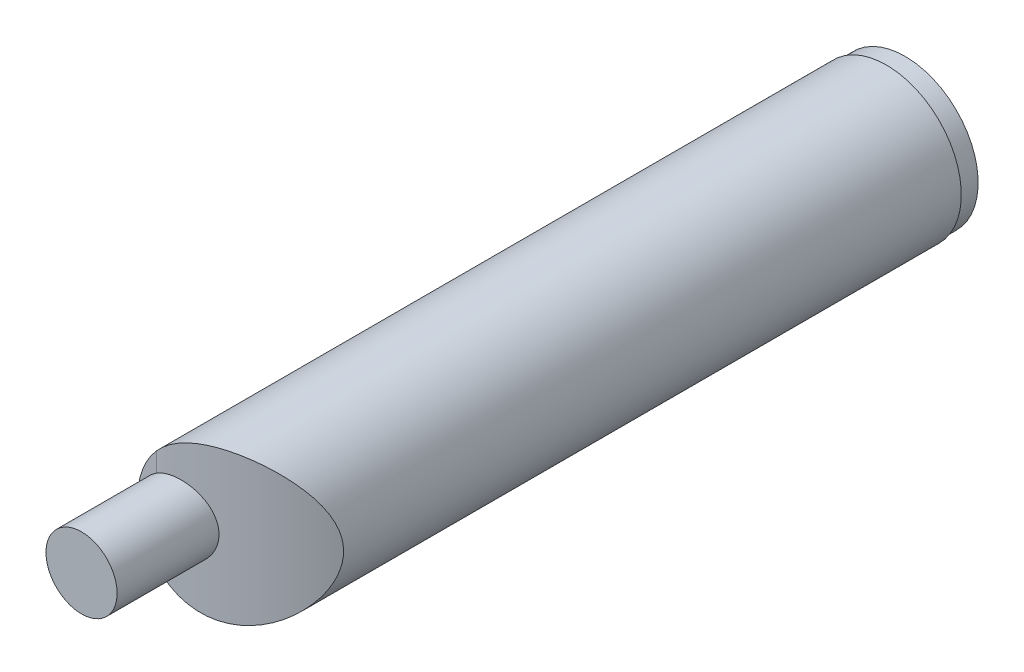
ISO-10303-21;
HEADER;
FILE_DESCRIPTION(('STEP AP214'),'2;1');
FILE_NAME('part.step','',(''),(''),'','','');
FILE_SCHEMA(('AUTOMOTIVE_DESIGN { 1 0 10303 214 1 1 1 1 }'));
ENDSEC;
DATA;
#1=APPLICATION_CONTEXT('core data for automotive mechanical design processes');
#2=APPLICATION_PROTOCOL_DEFINITION('international standard','automotive_design',2000,#1);
#3=PRODUCT_CONTEXT('',#1,'mechanical');
#4=PRODUCT('Part','Part','',(#3));
#5=PRODUCT_RELATED_PRODUCT_CATEGORY('part','',(#4));
#6=PRODUCT_DEFINITION_FORMATION('','',#4);
#7=PRODUCT_DEFINITION_CONTEXT('part definition',#1,'design');
#8=PRODUCT_DEFINITION('design','',#6,#7);
#9=PRODUCT_DEFINITION_SHAPE('','',#8);
#10=(LENGTH_UNIT() NAMED_UNIT(*) SI_UNIT(.MILLI.,.METRE.));
#11=(NAMED_UNIT(*) PLANE_ANGLE_UNIT() SI_UNIT($,.RADIAN.));
#12=(NAMED_UNIT(*) SI_UNIT($,.STERADIAN.) SOLID_ANGLE_UNIT());
#13=UNCERTAINTY_MEASURE_WITH_UNIT(LENGTH_MEASURE(1.E-05),#10,'distance_accuracy_value','');
#14=(GEOMETRIC_REPRESENTATION_CONTEXT(3) GLOBAL_UNCERTAINTY_ASSIGNED_CONTEXT((#13)) GLOBAL_UNIT_ASSIGNED_CONTEXT((#10,
#11,#12)) REPRESENTATION_CONTEXT('',''));
#15=CARTESIAN_POINT('',(0.,0.,0.));
#16=DIRECTION('',(0.,0.,1.));
#17=DIRECTION('',(1.,0.,0.));
#18=AXIS2_PLACEMENT_3D('',#15,#16,#17);
#19=CARTESIAN_POINT('',(0.,0.,37.));
#20=DIRECTION('',(0.,0.,1.));
#21=DIRECTION('',(1.,0.,0.));
#22=AXIS2_PLACEMENT_3D('',#19,#20,#21);
#23=PLANE('',#22);
#24=DIRECTION('',(0.,1.,0.));
#25=VECTOR('',#24,1.);
#26=CARTESIAN_POINT('',(-3.,-4.,37.));
#27=LINE('',#26,#25);
#28=CARTESIAN_POINT('',(-3.,-1.61554944214035,37.));
#29=VERTEX_POINT('',#28);
#30=CARTESIAN_POINT('',(-3.,-2.64575131106459,37.));
#31=VERTEX_POINT('',#30);
#32=EDGE_CURVE('E50',#29,#31,#27,.F.);
#33=ORIENTED_EDGE('',*,*,#32,.F.);
#34=CARTESIAN_POINT('',(-2.,0.,37.));
#35=DIRECTION('',(0.,0.,1.));
#36=DIRECTION('',(1.,0.,0.));
#37=AXIS2_PLACEMENT_3D('',#34,#35,#36);
#38=CIRCLE('',#37,1.9);
#39=CARTESIAN_POINT('',(-3.,1.61554944214035,37.));
#40=VERTEX_POINT('',#39);
#41=EDGE_CURVE('E72',#40,#29,#38,.T.);
#42=ORIENTED_EDGE('',*,*,#41,.F.);
#43=CARTESIAN_POINT('',(-3.,2.64575131106459,37.));
#44=VERTEX_POINT('',#43);
#45=EDGE_CURVE('E12',#44,#40,#27,.F.);
#46=ORIENTED_EDGE('',*,*,#45,.F.);
#47=CARTESIAN_POINT('',(0.,0.,37.));
#48=DIRECTION('',(0.,0.,1.));
#49=DIRECTION('',(1.,0.,0.));
#50=AXIS2_PLACEMENT_3D('',#47,#48,#49);
#51=CIRCLE('',#50,4.);
#52=EDGE_CURVE('E117',#44,#31,#51,.T.);
#53=ORIENTED_EDGE('',*,*,#52,.T.);
#54=EDGE_LOOP('',(#33,#42,#46,#53));
#55=FACE_BOUND('',#54,.T.);
#56=ADVANCED_FACE('F41',(#55),#23,.T.);
#57=CARTESIAN_POINT('',(-3.,-4.,27.3333333333333));
#58=DIRECTION('',(0.,1.,0.));
#59=DIRECTION('',(0.,0.,1.));
#60=AXIS2_PLACEMENT_3D('',#57,#58,#59);
#61=CYLINDRICAL_SURFACE('',#60,9.66666666666666);
#62=CARTESIAN_POINT('',(-3.,-1.61554944214035,37.));
#63=CARTESIAN_POINT('',(-2.95517958061528,-1.64329252204888,37.000001032105));
#64=CARTESIAN_POINT('',(-2.90922461089328,-1.66915645677503,36.99968779637));
#65=CARTESIAN_POINT('',(-2.8153357049746,-1.71697580833333,36.9983500260045));
#66=CARTESIAN_POINT('',(-2.76740181313537,-1.73893131271423,36.9973255073091));
#67=CARTESIAN_POINT('',(-2.6212541707077,-1.79863383992959,36.9930664159992));
#68=CARTESIAN_POINT('',(-2.52051730289532,-1.83032626236258,36.9886469520318));
#69=CARTESIAN_POINT('',(-2.31538706046502,-1.87659482098436,36.9762750540139));
#70=CARTESIAN_POINT('',(-2.21099152213248,-1.89116064651174,36.9683204957099));
#71=CARTESIAN_POINT('',(-2.00156850833603,-1.90288972701268,36.9488743750572));
#72=CARTESIAN_POINT('',(-1.89654115152249,-1.90005615344103,36.9373834576568));
#73=CARTESIAN_POINT('',(-1.68850211351172,-1.87721945316173,36.91119557089));
#74=CARTESIAN_POINT('',(-1.58549661541911,-1.85717015455387,36.8964900592374));
#75=CARTESIAN_POINT('',(-1.38450616355193,-1.80057583544492,36.8645971177407));
#76=CARTESIAN_POINT('',(-1.28652279026819,-1.76402565708877,36.8474089129983));
#77=CARTESIAN_POINT('',(-1.09588130480718,-1.67448991963964,36.8111187186533));
#78=CARTESIAN_POINT('',(-1.0034004134651,-1.62114133626977,36.7919814750124));
#79=CARTESIAN_POINT('',(-0.828686284516865,-1.49978030894426,36.753410691243));
#80=CARTESIAN_POINT('',(-0.746453997099637,-1.43176650691134,36.7339771238283));
#81=CARTESIAN_POINT('',(-0.592888034908227,-1.2813319837602,36.6958462018077));
#82=CARTESIAN_POINT('',(-0.521799029763533,-1.19865545897162,36.6771706859926));
#83=CARTESIAN_POINT('',(-0.39457622075868,-1.02198823257589,36.6424994167669));
#84=CARTESIAN_POINT('',(-0.338441569956993,-0.927998172149993,36.6265035116151));
#85=CARTESIAN_POINT('',(-0.243703350100563,-0.732805740717833,36.5988437200598));
#86=CARTESIAN_POINT('',(-0.204839366821026,-0.631739134851262,36.5871160035496));
#87=CARTESIAN_POINT('',(-0.144776397894455,-0.424052009574895,36.5687619987074));
#88=CARTESIAN_POINT('',(-0.123571639667147,-0.317433317191539,36.5621340433809));
#89=CARTESIAN_POINT('',(-0.100137065887266,-0.106410831973574,36.554796497094));
#90=CARTESIAN_POINT('',(-0.0971586472445877,-0.00209784625910809,36.5538534378124));
#91=CARTESIAN_POINT('',(-0.108289649199356,0.205512126969769,36.5573503167647));
#92=CARTESIAN_POINT('',(-0.122397254689809,0.308809221230669,36.5617896832053));
#93=CARTESIAN_POINT('',(-0.166773455177286,0.509572862967182,36.575507918806));
#94=CARTESIAN_POINT('',(-0.196749392878213,0.607110532850305,36.5846990817445));
#95=CARTESIAN_POINT('',(-0.271682870831143,0.795754152379224,36.6070731491861));
#96=CARTESIAN_POINT('',(-0.31664246828715,0.886859216768184,36.6202566017938));
#97=CARTESIAN_POINT('',(-0.421623582745281,1.06278158376739,36.6499563718835));
#98=CARTESIAN_POINT('',(-0.482022001466008,1.14736002773485,36.6665536892428));
#99=CARTESIAN_POINT('',(-0.615542613626594,1.30536678920883,36.701554233994));
#100=CARTESIAN_POINT('',(-0.688667424953865,1.37879280677008,36.7199578326072));
#101=CARTESIAN_POINT('',(-0.848891226532715,1.51540810472139,36.7579927900611));
#102=CARTESIAN_POINT('',(-0.936427285850951,1.5780800692756,36.7776439535781));
#103=CARTESIAN_POINT('',(-1.12096236909848,1.68784476875298,36.8160827448242));
#104=CARTESIAN_POINT('',(-1.21796247175424,1.73493572503594,36.8348702737549));
#105=CARTESIAN_POINT('',(-1.41981129037897,1.81250569515798,36.8705256886973));
#106=CARTESIAN_POINT('',(-1.52472482666052,1.84282551461708,36.8873740152814));
#107=CARTESIAN_POINT('',(-1.73862747103469,1.88508947435926,36.9179586742784));
#108=CARTESIAN_POINT('',(-1.8476158207198,1.89703701683703,36.9316955824646));
#109=CARTESIAN_POINT('',(-2.06397514459689,1.90193516242466,36.9551774101759));
#110=CARTESIAN_POINT('',(-2.17132786900129,1.89530412930968,36.965004643056));
#111=CARTESIAN_POINT('',(-2.3836381394675,1.86395281080554,36.9809165360836));
#112=CARTESIAN_POINT('',(-2.48859668876145,1.8392402512428,36.9870027926224));
#113=CARTESIAN_POINT('',(-2.66240982445681,1.78238939027777,36.9943707269203));
#114=CARTESIAN_POINT('',(-2.73270356887788,1.75465776673282,36.9965436444483));
#115=CARTESIAN_POINT('',(-2.86944648349164,1.69108093258636,36.9993623525555));
#116=CARTESIAN_POINT('',(-2.93590033823768,1.65524588202983,37.000010043949));
#117=CARTESIAN_POINT('',(-3.,1.61554944214035,37.));
#118=B_SPLINE_CURVE_WITH_KNOTS('',3,(#62,#63,#64,#65,#66,#67,#68,#69,#70,#71,#72,#73,#74,#75,
#76,#77,#78,#79,#80,#81,#82,#83,#84,#85,#86,#87,#88,#89,#90,#91,#92,#93,#94,#95,#96,#97,#98,#99,
#100,#101,#102,#103,#104,#105,#106,#107,#108,#109,#110,#111,#112,#113,#114,#115,#116,#117),
.UNSPECIFIED.,.F.,.F.,(4,2,2,2,2,2,2,2,2,2,2,2,2,2,2,2,2,2,2,2,2,2,2,2,2,2,2,4),(0.,
0.158040314803775,0.316077089062983,0.631533991882929,0.947180710968673,1.26276989763209,
1.57920813522519,1.89574535383446,2.21965622731877,2.54359710956618,2.8738749919205,
3.2041341649715,3.52922893911353,3.85421740207206,4.16576295753149,4.47727541934,
4.7832332041926,5.08923301329486,5.40356767110819,5.71796706584309,6.04475389049804,
6.37157800643768,6.70145336718532,7.03126763395883,7.35371501333552,7.67602469865251,
7.90229726183293,8.12828768306414),.UNSPECIFIED.);
#119=EDGE_CURVE('E56',#29,#40,#118,.T.);
#120=ORIENTED_EDGE('',*,*,#119,.F.);
#121=ORIENTED_EDGE('',*,*,#32,.T.);
#122=CARTESIAN_POINT('',(-3.,2.64575131106459,37.));
#123=CARTESIAN_POINT('',(-2.92874344411386,2.72656833880474,37.0000026929973));
#124=CARTESIAN_POINT('',(-2.85419861601261,2.80449367333995,36.9992124183074));
#125=CARTESIAN_POINT('',(-2.69908461475097,2.95406911188603,36.9956259653642));
#126=CARTESIAN_POINT('',(-2.61851460338466,3.02571833976148,36.9928295075499));
#127=CARTESIAN_POINT('',(-2.45194175088313,3.16221122973203,36.9848114066328));
#128=CARTESIAN_POINT('',(-2.36594016231447,3.22705645177371,36.9795903209178));
#129=CARTESIAN_POINT('',(-2.1891422961328,3.34950981012562,36.966339585779));
#130=CARTESIAN_POINT('',(-2.09834637843114,3.40711848859081,36.9583101469251));
#131=CARTESIAN_POINT('',(-1.91252526820566,3.51479661198446,36.9390909359259));
#132=CARTESIAN_POINT('',(-1.81749402150079,3.56485478485893,36.9278965090374));
#133=CARTESIAN_POINT('',(-1.62406290496324,3.6570345748119,36.9020722430745));
#134=CARTESIAN_POINT('',(-1.52566181382864,3.69915327770852,36.8874411469797));
#135=CARTESIAN_POINT('',(-1.32645424821065,3.77516501795386,36.8545657396904));
#136=CARTESIAN_POINT('',(-1.22565072312854,3.80906762291307,36.8363256765417));
#137=CARTESIAN_POINT('',(-1.02232354130945,3.86860205669459,36.7961017357514));
#138=CARTESIAN_POINT('',(-0.919799266398736,3.89423084324482,36.7741164855384));
#139=CARTESIAN_POINT('',(-0.715658602760959,3.93681512441491,36.7267890383231));
#140=CARTESIAN_POINT('',(-0.614056849194816,3.95391197938267,36.7015109591809));
#141=CARTESIAN_POINT('',(-0.410768834027507,3.98017475638854,36.6473776930199));
#142=CARTESIAN_POINT('',(-0.309082555208066,3.98933784626417,36.6185212328045));
#143=CARTESIAN_POINT('',(-0.0049603327433194,4.00513483658308,36.5267464130026));
#144=CARTESIAN_POINT('',(0.196628289481214,4.00009461277808,36.4586020395277));
#145=CARTESIAN_POINT('',(0.60159714223103,3.95998913295275,36.3067391447954));
#146=CARTESIAN_POINT('',(0.804608512255116,3.92351054570256,36.2224350600644));
#147=CARTESIAN_POINT('',(1.19833185521531,3.82169635277293,36.043399861453));
#148=CARTESIAN_POINT('',(1.38904220917318,3.75635695747048,35.9486673794791));
#149=CARTESIAN_POINT('',(1.77881397658153,3.58975378245759,35.7394239085914));
#150=CARTESIAN_POINT('',(1.97583567187145,3.48496978989151,35.6239316169755));
#151=CARTESIAN_POINT('',(2.34848795692548,3.24557442011722,35.388563858778));
#152=CARTESIAN_POINT('',(2.52408306453907,3.11091458065686,35.2686815378944));
#153=CARTESIAN_POINT('',(2.78045845835395,2.8783237558762,35.0821387269153));
#154=CARTESIAN_POINT('',(2.86940372121545,2.7896912950124,35.0148812345799));
#155=CARTESIAN_POINT('',(3.03920127263234,2.60367379812992,34.8821138878305));
#156=CARTESIAN_POINT('',(3.12005138772456,2.50628642475712,34.8166045062104));
#157=CARTESIAN_POINT('',(3.27293183980788,2.30305505681702,34.6889214332201));
#158=CARTESIAN_POINT('',(3.34497539956034,2.19722414488533,34.6267428216752));
#159=CARTESIAN_POINT('',(3.47959564824296,1.97712970024364,34.5074099851794));
#160=CARTESIAN_POINT('',(3.54217800392595,1.862871276672,34.4502527613502));
#161=CARTESIAN_POINT('',(3.6733067083788,1.59229689241465,34.3277295748455));
#162=CARTESIAN_POINT('',(3.73848625178331,1.43326221995032,34.2646530121973));
#163=CARTESIAN_POINT('',(3.84889048744412,1.10282032668692,34.1555939474905));
#164=CARTESIAN_POINT('',(3.89414575035773,0.931432533371165,34.1095852746483));
#165=CARTESIAN_POINT('',(3.9450656101658,0.666849780157054,34.057252527945));
#166=CARTESIAN_POINT('',(3.95924359622614,0.576861003822951,34.0425525829217));
#167=CARTESIAN_POINT('',(3.98146204643081,0.39534983419803,34.0194305776106));
#168=CARTESIAN_POINT('',(3.98950564335262,0.303828248138117,34.0110053129517));
#169=CARTESIAN_POINT('',(3.9992539324286,0.120106231005828,34.0007871795469));
#170=CARTESIAN_POINT('',(4.00096084884665,0.0279060495187175,33.998991983555));
#171=CARTESIAN_POINT('',(3.99800956039643,-0.156250856689758,34.0020890037284));
#172=CARTESIAN_POINT('',(3.99335190956097,-0.248207601904009,34.006980637808));
#173=CARTESIAN_POINT('',(3.97215891080682,-0.496716627410485,34.0291436665878));
#174=CARTESIAN_POINT('',(3.94949691645758,-0.652247912010089,34.0527815522623));
#175=CARTESIAN_POINT('',(3.88713995385376,-0.956205609506684,34.1166721530481));
#176=CARTESIAN_POINT('',(3.84743163376507,-1.1046263514359,34.1569378912745));
#177=CARTESIAN_POINT('',(3.73434636457543,-1.44883757630186,34.268861751576));
#178=CARTESIAN_POINT('',(3.65386958599505,-1.64029342739702,34.3466379694382));
#179=CARTESIAN_POINT('',(3.46827071755913,-2.00321014569202,34.5181698266454));
#180=CARTESIAN_POINT('',(3.36309068199038,-2.17462255942295,34.6119628928663));
#181=CARTESIAN_POINT('',(3.17302908125662,-2.43886018136553,34.77293631463));
#182=CARTESIAN_POINT('',(3.09438518485591,-2.53783125026085,34.8376052673484));
#183=CARTESIAN_POINT('',(2.92889605003813,-2.72715528020355,34.9690246136126));
#184=CARTESIAN_POINT('',(2.84205181617015,-2.81750929412967,35.035774751542));
#185=CARTESIAN_POINT('',(2.66059908004062,-2.98945489693459,35.170093958532));
#186=CARTESIAN_POINT('',(2.56598755144775,-3.07104304155433,35.2376633379663));
#187=CARTESIAN_POINT('',(2.36941399426397,-3.22513131932479,35.3724901121093));
#188=CARTESIAN_POINT('',(2.26745170472932,-3.29763112959941,35.4397474956521));
#189=CARTESIAN_POINT('',(2.05592940273685,-3.4335185756147,35.5733432708493));
#190=CARTESIAN_POINT('',(1.94632725242728,-3.49684858012791,35.6396736670128));
#191=CARTESIAN_POINT('',(1.72056966757837,-3.61327567922718,35.7700178673663));
#192=CARTESIAN_POINT('',(1.60441706478977,-3.66637715241393,35.8340326532417));
#193=CARTESIAN_POINT('',(1.36609998442459,-3.76167969117209,35.9588595655241));
#194=CARTESIAN_POINT('',(1.2439370362538,-3.80388351287906,36.0196724986111));
#195=CARTESIAN_POINT('',(0.994299413887674,-3.87663063623035,36.1372554002671));
#196=CARTESIAN_POINT('',(0.866825286990128,-3.90717513604572,36.1940257837809));
#197=CARTESIAN_POINT('',(0.615209704788986,-3.95435358487173,36.2995026290934));
#198=CARTESIAN_POINT('',(0.491320360166209,-3.97170630685601,36.3484878146022));
#199=CARTESIAN_POINT('',(0.240666934792276,-3.99473547119685,36.4415925713768));
#200=CARTESIAN_POINT('',(0.113903386958178,-4.00041406048712,36.4857130358772));
#201=CARTESIAN_POINT('',(-0.141158899570027,-3.99953951234272,36.568560900307));
#202=CARTESIAN_POINT('',(-0.269455377659925,-3.99300259761301,36.6072953796598));
#203=CARTESIAN_POINT('',(-0.526366383009214,-3.96731572070123,36.6791002494506));
#204=CARTESIAN_POINT('',(-0.654980846579341,-3.94816810799916,36.7121716935145));
#205=CARTESIAN_POINT('',(-0.891784160558105,-3.90090187363558,36.7679704774545));
#206=CARTESIAN_POINT('',(-1.00014120857132,-3.8745611977658,36.7915053674445));
#207=CARTESIAN_POINT('',(-1.2150221843455,-3.81263927728932,36.834401517043));
#208=CARTESIAN_POINT('',(-1.32154629778644,-3.77705897462191,36.8537632017235));
#209=CARTESIAN_POINT('',(-1.5318585319108,-3.69676741392903,36.8884563172856));
#210=CARTESIAN_POINT('',(-1.63564466850679,-3.6520497291307,36.9037848940276));
#211=CARTESIAN_POINT('',(-1.8394002368921,-3.55378560828444,36.9306249770668));
#212=CARTESIAN_POINT('',(-1.93937155404759,-3.50024360486655,36.9421383910983));
#213=CARTESIAN_POINT('',(-2.12678834417478,-3.38934466065737,36.9609027178673));
#214=CARTESIAN_POINT('',(-2.21459458939223,-3.3326408074284,36.9684219620944));
#215=CARTESIAN_POINT('',(-2.38561874174949,-3.21243652656539,36.9808372444938));
#216=CARTESIAN_POINT('',(-2.46883673733721,-3.14893623001616,36.9857333332485));
#217=CARTESIAN_POINT('',(-2.63007558090121,-3.01556644041895,36.9932563104231));
#218=CARTESIAN_POINT('',(-2.70809754974447,-2.94569832876424,36.995883689713));
#219=CARTESIAN_POINT('',(-2.85844676860409,-2.80004656197124,36.9992566353157));
#220=CARTESIAN_POINT('',(-2.93077430750579,-2.72426320730934,37.00000229715));
#221=CARTESIAN_POINT('',(-3.,-2.64575131106459,37.));
#222=B_SPLINE_CURVE_WITH_KNOTS('',3,(#122,#123,#124,#125,#126,#127,#128,#129,#130,#131,#132,
#133,#134,#135,#136,#137,#138,#139,#140,#141,#142,#143,#144,#145,#146,#147,#148,#149,#150,#151,
#152,#153,#154,#155,#156,#157,#158,#159,#160,#161,#162,#163,#164,#165,#166,#167,#168,#169,#170,
#171,#172,#173,#174,#175,#176,#177,#178,#179,#180,#181,#182,#183,#184,#185,#186,#187,#188,#189,
#190,#191,#192,#193,#194,#195,#196,#197,#198,#199,#200,#201,#202,#203,#204,#205,#206,#207,#208,
#209,#210,#211,#212,#213,#214,#215,#216,#217,#218,#219,#220,#221),.UNSPECIFIED.,.F.,.F.,(4,2,2,
2,2,2,2,2,2,2,2,2,2,2,2,2,2,2,2,2,2,2,2,2,2,2,2,2,2,2,2,2,2,2,2,2,2,2,2,2,2,2,2,2,2,2,2,2,2,4),
(0.,0.323151788824282,0.646348617516144,0.969471184585408,1.29256952916285,1.6161455481066,
1.9398401053201,2.26315589058986,2.58659042359854,2.90447177161188,3.22246654885787,
3.85817917591133,4.52405618483309,5.19002065399946,5.94096570991291,6.69313791381484,
7.12004478936913,7.54706597935071,7.97343792306898,8.3995534724468,8.94687201143385,
9.49334782487741,9.76981271888793,10.0461363300379,10.3223629385426,10.5985655031729,
11.073059726387,11.5479262856007,12.2096037451962,12.8728490628248,13.2983607030934,
13.7238202852411,14.149446431004,14.5750876934629,15.0032976464844,15.4313238832305,
15.8592417611832,16.2871156522773,16.6895630866289,17.0919365021818,17.4937759285841,
17.8955405100628,18.2370001885217,18.5784250703256,18.920090924887,19.2615856741056,
19.5756170306025,19.8896423313843,20.2035996709303,20.5175410727621),.UNSPECIFIED.);
#223=EDGE_CURVE('E61',#44,#31,#222,.T.);
#224=ORIENTED_EDGE('',*,*,#223,.F.);
#225=ORIENTED_EDGE('',*,*,#45,.T.);
#226=EDGE_LOOP('',(#120,#121,#224,#225));
#227=FACE_BOUND('',#226,.T.);
#228=ADVANCED_FACE('F67',(#227),#61,.T.);
#229=CARTESIAN_POINT('',(0.,0.,37.));
#230=DIRECTION('',(0.,0.,-1.));
#231=DIRECTION('',(-1.,0.,0.));
#232=AXIS2_PLACEMENT_3D('',#229,#230,#231);
#233=CYLINDRICAL_SURFACE('',#232,4.);
#234=CARTESIAN_POINT('',(0.,0.,1.));
#235=DIRECTION('',(0.,0.,-1.));
#236=DIRECTION('',(-1.,0.,0.));
#237=AXIS2_PLACEMENT_3D('',#234,#235,#236);
#238=CIRCLE('',#237,4.);
#239=CARTESIAN_POINT('',(-4.,0.,1.));
#240=VERTEX_POINT('',#239);
#241=EDGE_CURVE('E114',#240,#240,#238,.T.);
#242=ORIENTED_EDGE('',*,*,#241,.F.);
#243=EDGE_LOOP('',(#242));
#244=FACE_BOUND('',#243,.T.);
#245=ORIENTED_EDGE('',*,*,#52,.F.);
#246=ORIENTED_EDGE('',*,*,#223,.T.);
#247=EDGE_LOOP('',(#245,#246));
#248=FACE_BOUND('',#247,.T.);
#249=ADVANCED_FACE('F43',(#244,#248),#233,.T.);
#250=CARTESIAN_POINT('',(0.,0.,1.));
#251=DIRECTION('',(0.,0.,-1.));
#252=DIRECTION('',(-1.,0.,0.));
#253=AXIS2_PLACEMENT_3D('',#250,#251,#252);
#254=CYLINDRICAL_SURFACE('',#253,3.9);
#255=CARTESIAN_POINT('',(0.,0.,1.));
#256=DIRECTION('',(0.,0.,-1.));
#257=DIRECTION('',(-1.,0.,0.));
#258=AXIS2_PLACEMENT_3D('',#255,#256,#257);
#259=CIRCLE('',#258,3.9);
#260=CARTESIAN_POINT('',(-3.9,0.,1.));
#261=VERTEX_POINT('',#260);
#262=EDGE_CURVE('E111',#261,#261,#259,.T.);
#263=ORIENTED_EDGE('',*,*,#262,.T.);
#264=EDGE_LOOP('',(#263));
#265=FACE_BOUND('',#264,.T.);
#266=CARTESIAN_POINT('',(0.,0.,0.));
#267=DIRECTION('',(0.,0.,-1.));
#268=DIRECTION('',(-1.,0.,0.));
#269=AXIS2_PLACEMENT_3D('',#266,#267,#268);
#270=CIRCLE('',#269,3.9);
#271=CARTESIAN_POINT('',(-3.9,0.,0.));
#272=VERTEX_POINT('',#271);
#273=EDGE_CURVE('E108',#272,#272,#270,.T.);
#274=ORIENTED_EDGE('',*,*,#273,.F.);
#275=EDGE_LOOP('',(#274));
#276=FACE_BOUND('',#275,.T.);
#277=ADVANCED_FACE('F121',(#265,#276),#254,.T.);
#278=CARTESIAN_POINT('',(0.,0.,1.));
#279=DIRECTION('',(0.,0.,-1.));
#280=DIRECTION('',(-1.,0.,0.));
#281=AXIS2_PLACEMENT_3D('',#278,#279,#280);
#282=PLANE('',#281);
#283=ORIENTED_EDGE('',*,*,#262,.F.);
#284=EDGE_LOOP('',(#283));
#285=FACE_BOUND('',#284,.T.);
#286=ORIENTED_EDGE('',*,*,#241,.T.);
#287=EDGE_LOOP('',(#286));
#288=FACE_BOUND('',#287,.T.);
#289=ADVANCED_FACE('F126',(#285,#288),#282,.T.);
#290=CARTESIAN_POINT('',(0.,0.,0.));
#291=DIRECTION('',(0.,0.,1.));
#292=DIRECTION('',(1.,0.,0.));
#293=AXIS2_PLACEMENT_3D('',#290,#291,#292);
#294=PLANE('',#293);
#295=CARTESIAN_POINT('',(0.,0.,0.));
#296=DIRECTION('',(0.,0.,-1.));
#297=DIRECTION('',(-1.,0.,0.));
#298=AXIS2_PLACEMENT_3D('',#295,#296,#297);
#299=CIRCLE('',#298,0.5);
#300=CARTESIAN_POINT('',(-0.5,0.,0.));
#301=VERTEX_POINT('',#300);
#302=EDGE_CURVE('E104',#301,#301,#299,.T.);
#303=ORIENTED_EDGE('',*,*,#302,.F.);
#304=EDGE_LOOP('',(#303));
#305=FACE_BOUND('',#304,.T.);
#306=ORIENTED_EDGE('',*,*,#273,.T.);
#307=EDGE_LOOP('',(#306));
#308=FACE_BOUND('',#307,.T.);
#309=ADVANCED_FACE('F135',(#305,#308),#294,.F.);
#310=CARTESIAN_POINT('',(0.,0.,1.));
#311=DIRECTION('',(0.,0.,-1.));
#312=DIRECTION('',(-1.,0.,0.));
#313=AXIS2_PLACEMENT_3D('',#310,#311,#312);
#314=CYLINDRICAL_SURFACE('',#313,0.5);
#315=CARTESIAN_POINT('',(0.,0.,1.));
#316=DIRECTION('',(0.,0.,-1.));
#317=DIRECTION('',(-1.,0.,0.));
#318=AXIS2_PLACEMENT_3D('',#315,#316,#317);
#319=CIRCLE('',#318,0.5);
#320=CARTESIAN_POINT('',(-0.5,0.,1.));
#321=VERTEX_POINT('',#320);
#322=EDGE_CURVE('E105',#321,#321,#319,.T.);
#323=ORIENTED_EDGE('',*,*,#322,.F.);
#324=EDGE_LOOP('',(#323));
#325=FACE_BOUND('',#324,.T.);
#326=ORIENTED_EDGE('',*,*,#302,.T.);
#327=EDGE_LOOP('',(#326));
#328=FACE_BOUND('',#327,.T.);
#329=ADVANCED_FACE('F137',(#325,#328),#314,.F.);
#330=CARTESIAN_POINT('',(0.,0.,1.));
#331=DIRECTION('',(0.,0.,-1.));
#332=DIRECTION('',(-1.,0.,0.));
#333=AXIS2_PLACEMENT_3D('',#330,#331,#332);
#334=PLANE('',#333);
#335=ORIENTED_EDGE('',*,*,#322,.T.);
#336=EDGE_LOOP('',(#335));
#337=FACE_BOUND('',#336,.T.);
#338=ADVANCED_FACE('F93',(#337),#334,.T.);
#339=CARTESIAN_POINT('',(-2.,0.,42.));
#340=DIRECTION('',(0.,0.,-1.));
#341=DIRECTION('',(-1.,0.,0.));
#342=AXIS2_PLACEMENT_3D('',#339,#340,#341);
#343=CYLINDRICAL_SURFACE('',#342,1.9);
#344=CARTESIAN_POINT('',(-2.,0.,42.));
#345=DIRECTION('',(0.,0.,1.));
#346=DIRECTION('',(1.,0.,0.));
#347=AXIS2_PLACEMENT_3D('',#344,#345,#346);
#348=CIRCLE('',#347,1.9);
#349=CARTESIAN_POINT('',(-0.1,0.,42.));
#350=VERTEX_POINT('',#349);
#351=EDGE_CURVE('E74',#350,#350,#348,.T.);
#352=ORIENTED_EDGE('',*,*,#351,.F.);
#353=EDGE_LOOP('',(#352));
#354=FACE_BOUND('',#353,.T.);
#355=ORIENTED_EDGE('',*,*,#41,.T.);
#356=ORIENTED_EDGE('',*,*,#119,.T.);
#357=EDGE_LOOP('',(#355,#356));
#358=FACE_BOUND('',#357,.T.);
#359=ADVANCED_FACE('F76',(#354,#358),#343,.T.);
#360=CARTESIAN_POINT('',(-2.,0.,42.));
#361=DIRECTION('',(0.,0.,1.));
#362=DIRECTION('',(1.,0.,0.));
#363=AXIS2_PLACEMENT_3D('',#360,#361,#362);
#364=PLANE('',#363);
#365=ORIENTED_EDGE('',*,*,#351,.T.);
#366=EDGE_LOOP('',(#365));
#367=FACE_BOUND('',#366,.T.);
#368=ADVANCED_FACE('F87',(#367),#364,.T.);
#369=CLOSED_SHELL('',(#56,#228,#249,#277,#289,#309,#329,#338,#359,#368));
#370=MANIFOLD_SOLID_BREP('B2',#369);
#371=ADVANCED_BREP_SHAPE_REPRESENTATION('',(#18,#370),#14);
#372=SHAPE_DEFINITION_REPRESENTATION(#9,#371);
ENDSEC;
END-ISO-10303-21;
